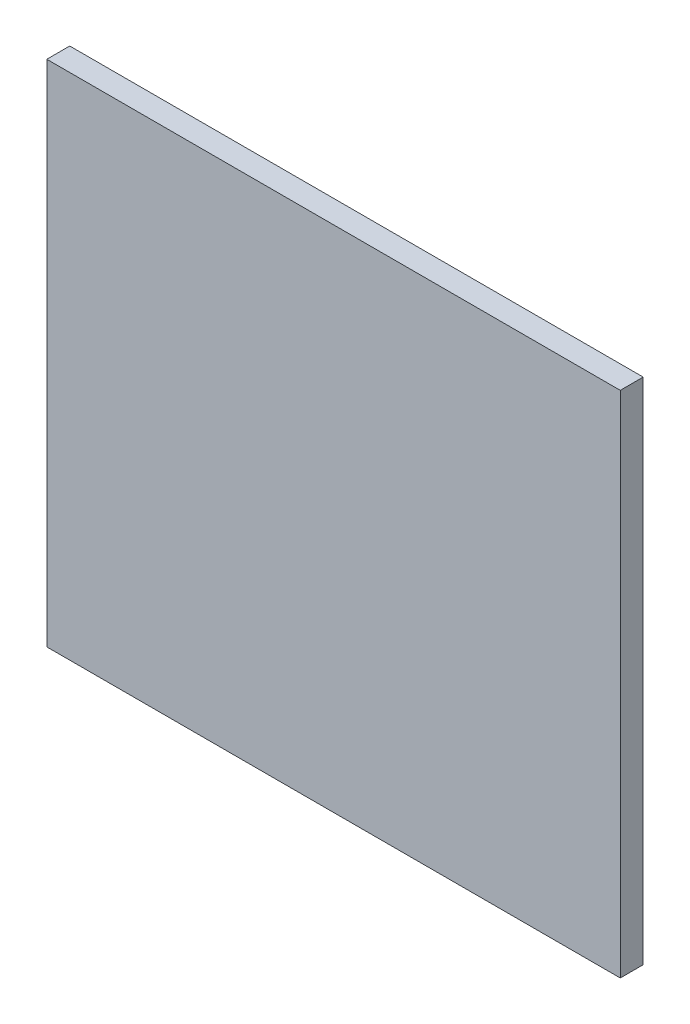
ISO-10303-21;
HEADER;
FILE_DESCRIPTION(('STEP AP214'),'2;1');
FILE_NAME('part.step','',(''),(''),'','','');
FILE_SCHEMA(('AUTOMOTIVE_DESIGN { 1 0 10303 214 1 1 1 1 }'));
ENDSEC;
DATA;
#1=APPLICATION_CONTEXT('core data for automotive mechanical design processes');
#2=APPLICATION_PROTOCOL_DEFINITION('international standard','automotive_design',2000,#1);
#3=PRODUCT_CONTEXT('',#1,'mechanical');
#4=PRODUCT('Part','Part','',(#3));
#5=PRODUCT_RELATED_PRODUCT_CATEGORY('part','',(#4));
#6=PRODUCT_DEFINITION_FORMATION('','',#4);
#7=PRODUCT_DEFINITION_CONTEXT('part definition',#1,'design');
#8=PRODUCT_DEFINITION('design','',#6,#7);
#9=PRODUCT_DEFINITION_SHAPE('','',#8);
#10=(LENGTH_UNIT() NAMED_UNIT(*) SI_UNIT(.MILLI.,.METRE.));
#11=(NAMED_UNIT(*) PLANE_ANGLE_UNIT() SI_UNIT($,.RADIAN.));
#12=(NAMED_UNIT(*) SI_UNIT($,.STERADIAN.) SOLID_ANGLE_UNIT());
#13=UNCERTAINTY_MEASURE_WITH_UNIT(LENGTH_MEASURE(1.E-05),#10,'distance_accuracy_value','');
#14=(GEOMETRIC_REPRESENTATION_CONTEXT(3) GLOBAL_UNCERTAINTY_ASSIGNED_CONTEXT((#13)) GLOBAL_UNIT_ASSIGNED_CONTEXT((#10,
#11,#12)) REPRESENTATION_CONTEXT('',''));
#15=CARTESIAN_POINT('',(0.,0.,0.));
#16=DIRECTION('',(0.,0.,1.));
#17=DIRECTION('',(1.,0.,0.));
#18=AXIS2_PLACEMENT_3D('',#15,#16,#17);
#19=CARTESIAN_POINT('',(200.,177.5,16.));
#20=DIRECTION('',(-1.,0.,0.));
#21=DIRECTION('',(0.,-1.,0.));
#22=AXIS2_PLACEMENT_3D('',#19,#20,#21);
#23=PLANE('',#22);
#24=DIRECTION('',(0.,1.,0.));
#25=VECTOR('',#24,1.);
#26=CARTESIAN_POINT('',(200.,177.5,0.));
#27=LINE('',#26,#25);
#28=CARTESIAN_POINT('',(200.,-177.5,0.));
#29=VERTEX_POINT('',#28);
#30=CARTESIAN_POINT('',(200.,177.5,0.));
#31=VERTEX_POINT('',#30);
#32=EDGE_CURVE('E98',#29,#31,#27,.T.);
#33=ORIENTED_EDGE('',*,*,#32,.T.);
#34=DIRECTION('',(0.,0.,-1.));
#35=VECTOR('',#34,1.);
#36=CARTESIAN_POINT('',(200.,177.5,16.));
#37=LINE('',#36,#35);
#38=CARTESIAN_POINT('',(200.,177.5,16.));
#39=VERTEX_POINT('',#38);
#40=EDGE_CURVE('E11',#39,#31,#37,.T.);
#41=ORIENTED_EDGE('',*,*,#40,.F.);
#42=DIRECTION('',(0.,1.,0.));
#43=VECTOR('',#42,1.);
#44=CARTESIAN_POINT('',(200.,177.5,16.));
#45=LINE('',#44,#43);
#46=CARTESIAN_POINT('',(200.,-177.5,16.));
#47=VERTEX_POINT('',#46);
#48=EDGE_CURVE('E86',#47,#39,#45,.T.);
#49=ORIENTED_EDGE('',*,*,#48,.F.);
#50=DIRECTION('',(0.,0.,-1.));
#51=VECTOR('',#50,1.);
#52=CARTESIAN_POINT('',(200.,-177.5,16.));
#53=LINE('',#52,#51);
#54=EDGE_CURVE('E94',#47,#29,#53,.T.);
#55=ORIENTED_EDGE('',*,*,#54,.T.);
#56=EDGE_LOOP('',(#33,#41,#49,#55));
#57=FACE_BOUND('',#56,.T.);
#58=ADVANCED_FACE('F35',(#57),#23,.F.);
#59=CARTESIAN_POINT('',(-200.,177.5,16.));
#60=DIRECTION('',(0.,-1.,0.));
#61=DIRECTION('',(0.,0.,-1.));
#62=AXIS2_PLACEMENT_3D('',#59,#60,#61);
#63=PLANE('',#62);
#64=DIRECTION('',(-1.,0.,0.));
#65=VECTOR('',#64,1.);
#66=CARTESIAN_POINT('',(-200.,177.5,0.));
#67=LINE('',#66,#65);
#68=CARTESIAN_POINT('',(-200.,177.5,0.));
#69=VERTEX_POINT('',#68);
#70=EDGE_CURVE('E90',#31,#69,#67,.T.);
#71=ORIENTED_EDGE('',*,*,#70,.T.);
#72=DIRECTION('',(0.,0.,-1.));
#73=VECTOR('',#72,1.);
#74=CARTESIAN_POINT('',(-200.,177.5,16.));
#75=LINE('',#74,#73);
#76=CARTESIAN_POINT('',(-200.,177.5,16.));
#77=VERTEX_POINT('',#76);
#78=EDGE_CURVE('E43',#77,#69,#75,.T.);
#79=ORIENTED_EDGE('',*,*,#78,.F.);
#80=DIRECTION('',(-1.,0.,0.));
#81=VECTOR('',#80,1.);
#82=CARTESIAN_POINT('',(-200.,177.5,16.));
#83=LINE('',#82,#81);
#84=EDGE_CURVE('E81',#39,#77,#83,.T.);
#85=ORIENTED_EDGE('',*,*,#84,.F.);
#86=ORIENTED_EDGE('',*,*,#40,.T.);
#87=EDGE_LOOP('',(#71,#79,#85,#86));
#88=FACE_BOUND('',#87,.T.);
#89=ADVANCED_FACE('F89',(#88),#63,.F.);
#90=CARTESIAN_POINT('',(-200.,177.5,16.));
#91=DIRECTION('',(1.,0.,0.));
#92=DIRECTION('',(0.,1.,0.));
#93=AXIS2_PLACEMENT_3D('',#90,#91,#92);
#94=PLANE('',#93);
#95=DIRECTION('',(0.,-1.,0.));
#96=VECTOR('',#95,1.);
#97=CARTESIAN_POINT('',(-200.,177.5,0.));
#98=LINE('',#97,#96);
#99=CARTESIAN_POINT('',(-200.,-177.5,0.));
#100=VERTEX_POINT('',#99);
#101=EDGE_CURVE('E68',#69,#100,#98,.T.);
#102=ORIENTED_EDGE('',*,*,#101,.T.);
#103=DIRECTION('',(0.,0.,-1.));
#104=VECTOR('',#103,1.);
#105=CARTESIAN_POINT('',(-200.,-177.5,16.));
#106=LINE('',#105,#104);
#107=CARTESIAN_POINT('',(-200.,-177.5,16.));
#108=VERTEX_POINT('',#107);
#109=EDGE_CURVE('E91',#108,#100,#106,.T.);
#110=ORIENTED_EDGE('',*,*,#109,.F.);
#111=DIRECTION('',(0.,-1.,0.));
#112=VECTOR('',#111,1.);
#113=CARTESIAN_POINT('',(-200.,177.5,16.));
#114=LINE('',#113,#112);
#115=EDGE_CURVE('E84',#77,#108,#114,.T.);
#116=ORIENTED_EDGE('',*,*,#115,.F.);
#117=ORIENTED_EDGE('',*,*,#78,.T.);
#118=EDGE_LOOP('',(#102,#110,#116,#117));
#119=FACE_BOUND('',#118,.T.);
#120=ADVANCED_FACE('F92',(#119),#94,.F.);
#121=CARTESIAN_POINT('',(-200.,-177.5,16.));
#122=DIRECTION('',(0.,1.,0.));
#123=DIRECTION('',(0.,0.,1.));
#124=AXIS2_PLACEMENT_3D('',#121,#122,#123);
#125=PLANE('',#124);
#126=DIRECTION('',(1.,0.,0.));
#127=VECTOR('',#126,1.);
#128=CARTESIAN_POINT('',(-200.,-177.5,0.));
#129=LINE('',#128,#127);
#130=EDGE_CURVE('E74',#100,#29,#129,.T.);
#131=ORIENTED_EDGE('',*,*,#130,.T.);
#132=ORIENTED_EDGE('',*,*,#54,.F.);
#133=DIRECTION('',(1.,0.,0.));
#134=VECTOR('',#133,1.);
#135=CARTESIAN_POINT('',(-200.,-177.5,16.));
#136=LINE('',#135,#134);
#137=EDGE_CURVE('E51',#108,#47,#136,.T.);
#138=ORIENTED_EDGE('',*,*,#137,.F.);
#139=ORIENTED_EDGE('',*,*,#109,.T.);
#140=EDGE_LOOP('',(#131,#132,#138,#139));
#141=FACE_BOUND('',#140,.T.);
#142=ADVANCED_FACE('F105',(#141),#125,.F.);
#143=CARTESIAN_POINT('',(0.,0.,16.));
#144=DIRECTION('',(0.,0.,1.));
#145=DIRECTION('',(1.,0.,0.));
#146=AXIS2_PLACEMENT_3D('',#143,#144,#145);
#147=PLANE('',#146);
#148=ORIENTED_EDGE('',*,*,#48,.T.);
#149=ORIENTED_EDGE('',*,*,#84,.T.);
#150=ORIENTED_EDGE('',*,*,#115,.T.);
#151=ORIENTED_EDGE('',*,*,#137,.T.);
#152=EDGE_LOOP('',(#148,#149,#150,#151));
#153=FACE_BOUND('',#152,.T.);
#154=ADVANCED_FACE('F82',(#153),#147,.T.);
#155=CARTESIAN_POINT('',(0.,0.,0.));
#156=DIRECTION('',(0.,0.,1.));
#157=DIRECTION('',(1.,0.,0.));
#158=AXIS2_PLACEMENT_3D('',#155,#156,#157);
#159=PLANE('',#158);
#160=ORIENTED_EDGE('',*,*,#32,.F.);
#161=ORIENTED_EDGE('',*,*,#130,.F.);
#162=ORIENTED_EDGE('',*,*,#101,.F.);
#163=ORIENTED_EDGE('',*,*,#70,.F.);
#164=EDGE_LOOP('',(#160,#161,#162,#163));
#165=FACE_BOUND('',#164,.T.);
#166=ADVANCED_FACE('F108',(#165),#159,.F.);
#167=CLOSED_SHELL('',(#58,#89,#120,#142,#154,#166));
#168=MANIFOLD_SOLID_BREP('B2',#167);
#169=ADVANCED_BREP_SHAPE_REPRESENTATION('',(#18,#168),#14);
#170=SHAPE_DEFINITION_REPRESENTATION(#9,#169);
ENDSEC;
END-ISO-10303-21;
